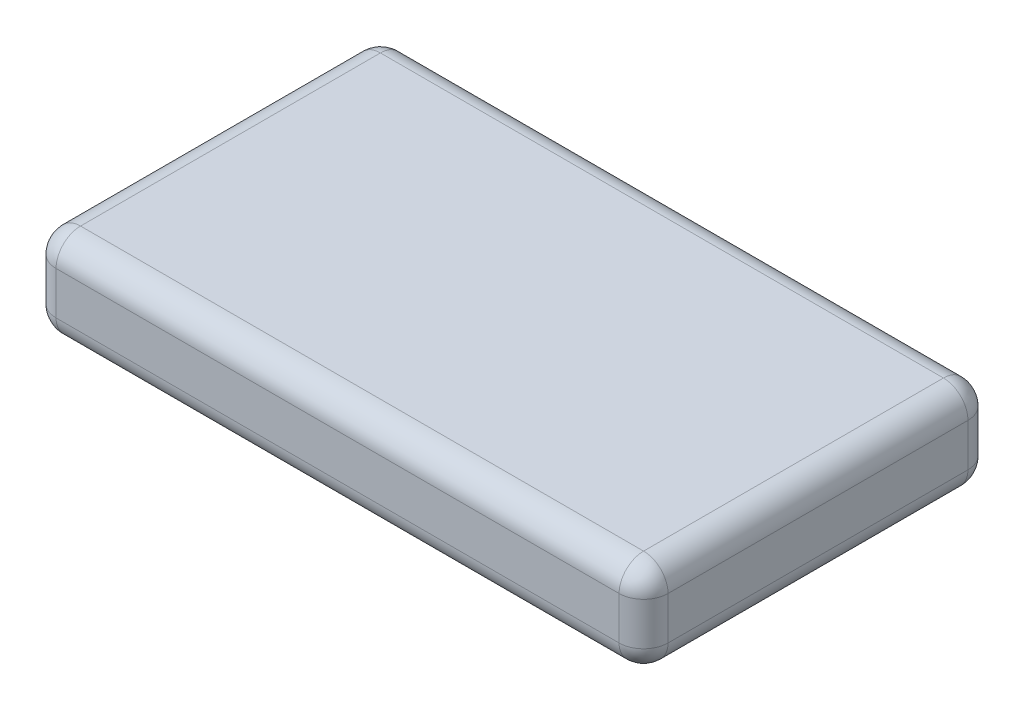
ISO-10303-21;
HEADER;
FILE_DESCRIPTION(('STEP AP214'),'2;1');
FILE_NAME('part.step','',(''),(''),'','','');
FILE_SCHEMA(('AUTOMOTIVE_DESIGN { 1 0 10303 214 1 1 1 1 }'));
ENDSEC;
DATA;
#1=APPLICATION_CONTEXT('core data for automotive mechanical design processes');
#2=APPLICATION_PROTOCOL_DEFINITION('international standard','automotive_design',2000,#1);
#3=PRODUCT_CONTEXT('',#1,'mechanical');
#4=PRODUCT('Part','Part','',(#3));
#5=PRODUCT_RELATED_PRODUCT_CATEGORY('part','',(#4));
#6=PRODUCT_DEFINITION_FORMATION('','',#4);
#7=PRODUCT_DEFINITION_CONTEXT('part definition',#1,'design');
#8=PRODUCT_DEFINITION('design','',#6,#7);
#9=PRODUCT_DEFINITION_SHAPE('','',#8);
#10=(LENGTH_UNIT() NAMED_UNIT(*) SI_UNIT(.MILLI.,.METRE.));
#11=(NAMED_UNIT(*) PLANE_ANGLE_UNIT() SI_UNIT($,.RADIAN.));
#12=(NAMED_UNIT(*) SI_UNIT($,.STERADIAN.) SOLID_ANGLE_UNIT());
#13=UNCERTAINTY_MEASURE_WITH_UNIT(LENGTH_MEASURE(1.E-05),#10,'distance_accuracy_value','');
#14=(GEOMETRIC_REPRESENTATION_CONTEXT(3) GLOBAL_UNCERTAINTY_ASSIGNED_CONTEXT((#13)) GLOBAL_UNIT_ASSIGNED_CONTEXT((#10,
#11,#12)) REPRESENTATION_CONTEXT('',''));
#15=CARTESIAN_POINT('',(0.,0.,0.));
#16=DIRECTION('',(0.,0.,1.));
#17=DIRECTION('',(1.,0.,0.));
#18=AXIS2_PLACEMENT_3D('',#15,#16,#17);
#19=CARTESIAN_POINT('',(25.,7.5,-14.25));
#20=DIRECTION('',(-1.,0.,0.));
#21=DIRECTION('',(0.,0.,1.));
#22=AXIS2_PLACEMENT_3D('',#19,#20,#21);
#23=PLANE('',#22);
#24=DIRECTION('',(0.,0.,-1.));
#25=VECTOR('',#24,1.);
#26=CARTESIAN_POINT('',(25.,2.,-14.25));
#27=LINE('',#26,#25);
#28=CARTESIAN_POINT('',(25.,2.,12.25));
#29=VERTEX_POINT('',#28);
#30=CARTESIAN_POINT('',(25.,2.,-12.25));
#31=VERTEX_POINT('',#30);
#32=EDGE_CURVE('E183',#29,#31,#27,.T.);
#33=ORIENTED_EDGE('',*,*,#32,.T.);
#34=DIRECTION('',(0.,-1.,0.));
#35=VECTOR('',#34,1.);
#36=CARTESIAN_POINT('',(25.,7.5,-12.25));
#37=LINE('',#36,#35);
#38=CARTESIAN_POINT('',(25.,5.5,-12.25));
#39=VERTEX_POINT('',#38);
#40=EDGE_CURVE('E186',#31,#39,#37,.F.);
#41=ORIENTED_EDGE('',*,*,#40,.T.);
#42=DIRECTION('',(0.,0.,-1.));
#43=VECTOR('',#42,1.);
#44=CARTESIAN_POINT('',(25.,5.5,14.25));
#45=LINE('',#44,#43);
#46=CARTESIAN_POINT('',(25.,5.5,12.25));
#47=VERTEX_POINT('',#46);
#48=EDGE_CURVE('E177',#39,#47,#45,.F.);
#49=ORIENTED_EDGE('',*,*,#48,.T.);
#50=DIRECTION('',(0.,-1.,0.));
#51=VECTOR('',#50,1.);
#52=CARTESIAN_POINT('',(25.,7.5,12.25));
#53=LINE('',#52,#51);
#54=EDGE_CURVE('E180',#47,#29,#53,.T.);
#55=ORIENTED_EDGE('',*,*,#54,.T.);
#56=EDGE_LOOP('',(#33,#41,#49,#55));
#57=FACE_BOUND('',#56,.T.);
#58=ADVANCED_FACE('F37',(#57),#23,.F.);
#59=CARTESIAN_POINT('',(-25.,7.5,-14.25));
#60=DIRECTION('',(0.,0.,1.));
#61=DIRECTION('',(1.,0.,0.));
#62=AXIS2_PLACEMENT_3D('',#59,#60,#61);
#63=PLANE('',#62);
#64=DIRECTION('',(0.,-1.,0.));
#65=VECTOR('',#64,1.);
#66=CARTESIAN_POINT('',(23.,7.5,-14.25));
#67=LINE('',#66,#65);
#68=CARTESIAN_POINT('',(23.,5.5,-14.25));
#69=VERTEX_POINT('',#68);
#70=CARTESIAN_POINT('',(23.,2.,-14.25));
#71=VERTEX_POINT('',#70);
#72=EDGE_CURVE('E138',#69,#71,#67,.T.);
#73=ORIENTED_EDGE('',*,*,#72,.T.);
#74=DIRECTION('',(-1.,0.,0.));
#75=VECTOR('',#74,1.);
#76=CARTESIAN_POINT('',(-25.,2.,-14.25));
#77=LINE('',#76,#75);
#78=CARTESIAN_POINT('',(-23.,2.,-14.25));
#79=VERTEX_POINT('',#78);
#80=EDGE_CURVE('E133',#71,#79,#77,.T.);
#81=ORIENTED_EDGE('',*,*,#80,.T.);
#82=DIRECTION('',(0.,-1.,0.));
#83=VECTOR('',#82,1.);
#84=CARTESIAN_POINT('',(-23.,7.5,-14.25));
#85=LINE('',#84,#83);
#86=CARTESIAN_POINT('',(-23.,5.5,-14.25));
#87=VERTEX_POINT('',#86);
#88=EDGE_CURVE('E125',#79,#87,#85,.F.);
#89=ORIENTED_EDGE('',*,*,#88,.T.);
#90=DIRECTION('',(-1.,0.,0.));
#91=VECTOR('',#90,1.);
#92=CARTESIAN_POINT('',(25.,5.5,-14.25));
#93=LINE('',#92,#91);
#94=EDGE_CURVE('E130',#87,#69,#93,.F.);
#95=ORIENTED_EDGE('',*,*,#94,.T.);
#96=EDGE_LOOP('',(#73,#81,#89,#95));
#97=FACE_BOUND('',#96,.T.);
#98=ADVANCED_FACE('F128',(#97),#63,.F.);
#99=CARTESIAN_POINT('',(-25.,7.5,-14.25));
#100=DIRECTION('',(1.,0.,0.));
#101=DIRECTION('',(0.,0.,-1.));
#102=AXIS2_PLACEMENT_3D('',#99,#100,#101);
#103=PLANE('',#102);
#104=DIRECTION('',(0.,0.,1.));
#105=VECTOR('',#104,1.);
#106=CARTESIAN_POINT('',(-25.,5.5,-14.25));
#107=LINE('',#106,#105);
#108=CARTESIAN_POINT('',(-25.,5.5,12.25));
#109=VERTEX_POINT('',#108);
#110=CARTESIAN_POINT('',(-25.,5.5,-12.25));
#111=VERTEX_POINT('',#110);
#112=EDGE_CURVE('E190',#109,#111,#107,.F.);
#113=ORIENTED_EDGE('',*,*,#112,.T.);
#114=DIRECTION('',(0.,-1.,0.));
#115=VECTOR('',#114,1.);
#116=CARTESIAN_POINT('',(-25.,7.5,-12.25));
#117=LINE('',#116,#115);
#118=CARTESIAN_POINT('',(-25.,2.,-12.25));
#119=VERTEX_POINT('',#118);
#120=EDGE_CURVE('E146',#111,#119,#117,.T.);
#121=ORIENTED_EDGE('',*,*,#120,.T.);
#122=DIRECTION('',(0.,0.,1.));
#123=VECTOR('',#122,1.);
#124=CARTESIAN_POINT('',(-25.,2.,-14.25));
#125=LINE('',#124,#123);
#126=CARTESIAN_POINT('',(-25.,2.,12.25));
#127=VERTEX_POINT('',#126);
#128=EDGE_CURVE('E196',#119,#127,#125,.T.);
#129=ORIENTED_EDGE('',*,*,#128,.T.);
#130=DIRECTION('',(0.,-1.,0.));
#131=VECTOR('',#130,1.);
#132=CARTESIAN_POINT('',(-25.,7.5,12.25));
#133=LINE('',#132,#131);
#134=EDGE_CURVE('E193',#127,#109,#133,.F.);
#135=ORIENTED_EDGE('',*,*,#134,.T.);
#136=EDGE_LOOP('',(#113,#121,#129,#135));
#137=FACE_BOUND('',#136,.T.);
#138=ADVANCED_FACE('F376',(#137),#103,.F.);
#139=CARTESIAN_POINT('',(-25.,7.5,14.25));
#140=DIRECTION('',(0.,0.,-1.));
#141=DIRECTION('',(-1.,0.,0.));
#142=AXIS2_PLACEMENT_3D('',#139,#140,#141);
#143=PLANE('',#142);
#144=DIRECTION('',(0.,-1.,0.));
#145=VECTOR('',#144,1.);
#146=CARTESIAN_POINT('',(-23.,7.5,14.25));
#147=LINE('',#146,#145);
#148=CARTESIAN_POINT('',(-23.,5.5,14.25));
#149=VERTEX_POINT('',#148);
#150=CARTESIAN_POINT('',(-23.,2.,14.25));
#151=VERTEX_POINT('',#150);
#152=EDGE_CURVE('E220',#149,#151,#147,.T.);
#153=ORIENTED_EDGE('',*,*,#152,.T.);
#154=DIRECTION('',(1.,0.,0.));
#155=VECTOR('',#154,1.);
#156=CARTESIAN_POINT('',(-25.,2.,14.25));
#157=LINE('',#156,#155);
#158=CARTESIAN_POINT('',(23.,2.,14.25));
#159=VERTEX_POINT('',#158);
#160=EDGE_CURVE('E224',#151,#159,#157,.T.);
#161=ORIENTED_EDGE('',*,*,#160,.T.);
#162=DIRECTION('',(0.,-1.,0.));
#163=VECTOR('',#162,1.);
#164=CARTESIAN_POINT('',(23.,7.5,14.25));
#165=LINE('',#164,#163);
#166=CARTESIAN_POINT('',(23.,5.5,14.25));
#167=VERTEX_POINT('',#166);
#168=EDGE_CURVE('E217',#159,#167,#165,.F.);
#169=ORIENTED_EDGE('',*,*,#168,.T.);
#170=DIRECTION('',(1.,0.,0.));
#171=VECTOR('',#170,1.);
#172=CARTESIAN_POINT('',(-25.,5.5,14.25));
#173=LINE('',#172,#171);
#174=EDGE_CURVE('E214',#167,#149,#173,.F.);
#175=ORIENTED_EDGE('',*,*,#174,.T.);
#176=EDGE_LOOP('',(#153,#161,#169,#175));
#177=FACE_BOUND('',#176,.T.);
#178=ADVANCED_FACE('F325',(#177),#143,.F.);
#179=CARTESIAN_POINT('',(0.,7.5,0.));
#180=DIRECTION('',(0.,1.,0.));
#181=DIRECTION('',(0.,0.,1.));
#182=AXIS2_PLACEMENT_3D('',#179,#180,#181);
#183=PLANE('',#182);
#184=DIRECTION('',(0.,0.,1.));
#185=VECTOR('',#184,1.);
#186=CARTESIAN_POINT('',(-23.,7.5,14.25));
#187=LINE('',#186,#185);
#188=CARTESIAN_POINT('',(-23.,7.5,-12.25));
#189=VERTEX_POINT('',#188);
#190=CARTESIAN_POINT('',(-23.,7.5,12.25));
#191=VERTEX_POINT('',#190);
#192=EDGE_CURVE('E47',#189,#191,#187,.T.);
#193=ORIENTED_EDGE('',*,*,#192,.T.);
#194=DIRECTION('',(1.,0.,0.));
#195=VECTOR('',#194,1.);
#196=CARTESIAN_POINT('',(25.,7.5,12.25));
#197=LINE('',#196,#195);
#198=CARTESIAN_POINT('',(23.,7.5,12.25));
#199=VERTEX_POINT('',#198);
#200=EDGE_CURVE('E11',#191,#199,#197,.T.);
#201=ORIENTED_EDGE('',*,*,#200,.T.);
#202=DIRECTION('',(0.,0.,-1.));
#203=VECTOR('',#202,1.);
#204=CARTESIAN_POINT('',(23.,7.5,-14.25));
#205=LINE('',#204,#203);
#206=CARTESIAN_POINT('',(23.,7.5,-12.25));
#207=VERTEX_POINT('',#206);
#208=EDGE_CURVE('E227',#199,#207,#205,.T.);
#209=ORIENTED_EDGE('',*,*,#208,.T.);
#210=DIRECTION('',(-1.,0.,0.));
#211=VECTOR('',#210,1.);
#212=CARTESIAN_POINT('',(-25.,7.5,-12.25));
#213=LINE('',#212,#211);
#214=EDGE_CURVE('E58',#207,#189,#213,.T.);
#215=ORIENTED_EDGE('',*,*,#214,.T.);
#216=EDGE_LOOP('',(#193,#201,#209,#215));
#217=FACE_BOUND('',#216,.T.);
#218=ADVANCED_FACE('F340',(#217),#183,.T.);
#219=CARTESIAN_POINT('',(0.,0.,0.));
#220=DIRECTION('',(0.,1.,0.));
#221=DIRECTION('',(0.,0.,1.));
#222=AXIS2_PLACEMENT_3D('',#219,#220,#221);
#223=PLANE('',#222);
#224=DIRECTION('',(0.,0.,1.));
#225=VECTOR('',#224,1.);
#226=CARTESIAN_POINT('',(-23.,0.,0.));
#227=LINE('',#226,#225);
#228=CARTESIAN_POINT('',(-23.,0.,12.25));
#229=VERTEX_POINT('',#228);
#230=CARTESIAN_POINT('',(-23.,0.,-12.25));
#231=VERTEX_POINT('',#230);
#232=EDGE_CURVE('E207',#229,#231,#227,.F.);
#233=ORIENTED_EDGE('',*,*,#232,.T.);
#234=DIRECTION('',(-1.,0.,0.));
#235=VECTOR('',#234,1.);
#236=CARTESIAN_POINT('',(0.,0.,-12.25));
#237=LINE('',#236,#235);
#238=CARTESIAN_POINT('',(23.,0.,-12.25));
#239=VERTEX_POINT('',#238);
#240=EDGE_CURVE('E210',#231,#239,#237,.F.);
#241=ORIENTED_EDGE('',*,*,#240,.T.);
#242=DIRECTION('',(0.,0.,-1.));
#243=VECTOR('',#242,1.);
#244=CARTESIAN_POINT('',(23.,0.,0.));
#245=LINE('',#244,#243);
#246=CARTESIAN_POINT('',(23.,0.,12.25));
#247=VERTEX_POINT('',#246);
#248=EDGE_CURVE('E204',#239,#247,#245,.F.);
#249=ORIENTED_EDGE('',*,*,#248,.T.);
#250=DIRECTION('',(1.,0.,0.));
#251=VECTOR('',#250,1.);
#252=CARTESIAN_POINT('',(0.,0.,12.25));
#253=LINE('',#252,#251);
#254=EDGE_CURVE('E201',#247,#229,#253,.F.);
#255=ORIENTED_EDGE('',*,*,#254,.T.);
#256=EDGE_LOOP('',(#233,#241,#249,#255));
#257=FACE_BOUND('',#256,.T.);
#258=ADVANCED_FACE('F316',(#257),#223,.F.);
#259=CARTESIAN_POINT('',(-23.,7.5,12.25));
#260=DIRECTION('',(0.,-1.,0.));
#261=DIRECTION('',(0.,0.,-1.));
#262=AXIS2_PLACEMENT_3D('',#259,#260,#261);
#263=CYLINDRICAL_SURFACE('',#262,2.);
#264=CARTESIAN_POINT('',(-23.,5.5,12.25));
#265=DIRECTION('',(0.,1.,0.));
#266=DIRECTION('',(0.,0.,1.));
#267=AXIS2_PLACEMENT_3D('',#264,#265,#266);
#268=CIRCLE('',#267,2.);
#269=EDGE_CURVE('E41',#109,#149,#268,.T.);
#270=ORIENTED_EDGE('',*,*,#269,.F.);
#271=ORIENTED_EDGE('',*,*,#134,.F.);
#272=CARTESIAN_POINT('',(-23.,2.,12.25));
#273=DIRECTION('',(0.,-1.,0.));
#274=DIRECTION('',(0.,0.,-1.));
#275=AXIS2_PLACEMENT_3D('',#272,#273,#274);
#276=CIRCLE('',#275,2.);
#277=EDGE_CURVE('E171',#151,#127,#276,.T.);
#278=ORIENTED_EDGE('',*,*,#277,.F.);
#279=ORIENTED_EDGE('',*,*,#152,.F.);
#280=EDGE_LOOP('',(#270,#271,#278,#279));
#281=FACE_BOUND('',#280,.T.);
#282=ADVANCED_FACE('F39',(#281),#263,.T.);
#283=CARTESIAN_POINT('',(-23.,5.5,12.25));
#284=DIRECTION('',(0.,0.,1.));
#285=DIRECTION('',(1.,0.,0.));
#286=AXIS2_PLACEMENT_3D('',#283,#284,#285);
#287=SPHERICAL_SURFACE('',#286,2.);
#288=CARTESIAN_POINT('',(-23.,5.5,12.25));
#289=DIRECTION('',(0.,0.,1.));
#290=DIRECTION('',(1.,0.,0.));
#291=AXIS2_PLACEMENT_3D('',#288,#289,#290);
#292=CIRCLE('',#291,2.);
#293=EDGE_CURVE('E293',#109,#191,#292,.F.);
#294=ORIENTED_EDGE('',*,*,#293,.F.);
#295=ORIENTED_EDGE('',*,*,#269,.T.);
#296=CARTESIAN_POINT('',(-23.,5.5,12.25));
#297=DIRECTION('',(-1.,0.,0.));
#298=DIRECTION('',(0.,-1.,0.));
#299=AXIS2_PLACEMENT_3D('',#296,#297,#298);
#300=CIRCLE('',#299,2.);
#301=EDGE_CURVE('E296',#191,#149,#300,.F.);
#302=ORIENTED_EDGE('',*,*,#301,.F.);
#303=EDGE_LOOP('',(#294,#295,#302));
#304=FACE_BOUND('',#303,.T.);
#305=ADVANCED_FACE('F526',(#304),#287,.T.);
#306=CARTESIAN_POINT('',(-23.,2.,12.25));
#307=DIRECTION('',(0.,0.,1.));
#308=DIRECTION('',(1.,0.,0.));
#309=AXIS2_PLACEMENT_3D('',#306,#307,#308);
#310=SPHERICAL_SURFACE('',#309,2.);
#311=CARTESIAN_POINT('',(-23.,2.,12.25));
#312=DIRECTION('',(-1.,0.,0.));
#313=DIRECTION('',(0.,0.,1.));
#314=AXIS2_PLACEMENT_3D('',#311,#312,#313);
#315=CIRCLE('',#314,2.);
#316=EDGE_CURVE('E286',#151,#229,#315,.F.);
#317=ORIENTED_EDGE('',*,*,#316,.F.);
#318=ORIENTED_EDGE('',*,*,#277,.T.);
#319=CARTESIAN_POINT('',(-23.,2.,12.25));
#320=DIRECTION('',(0.,0.,1.));
#321=DIRECTION('',(1.,0.,0.));
#322=AXIS2_PLACEMENT_3D('',#319,#320,#321);
#323=CIRCLE('',#322,2.);
#324=EDGE_CURVE('E289',#229,#127,#323,.F.);
#325=ORIENTED_EDGE('',*,*,#324,.F.);
#326=EDGE_LOOP('',(#317,#318,#325));
#327=FACE_BOUND('',#326,.T.);
#328=ADVANCED_FACE('F305',(#327),#310,.T.);
#329=CARTESIAN_POINT('',(0.,5.5,12.25));
#330=DIRECTION('',(-1.,0.,0.));
#331=DIRECTION('',(0.,0.,1.));
#332=AXIS2_PLACEMENT_3D('',#329,#330,#331);
#333=CYLINDRICAL_SURFACE('',#332,2.);
#334=ORIENTED_EDGE('',*,*,#301,.T.);
#335=ORIENTED_EDGE('',*,*,#174,.F.);
#336=CARTESIAN_POINT('',(23.,5.5,12.25));
#337=DIRECTION('',(1.,0.,0.));
#338=DIRECTION('',(0.,0.,-1.));
#339=AXIS2_PLACEMENT_3D('',#336,#337,#338);
#340=CIRCLE('',#339,2.);
#341=EDGE_CURVE('E278',#199,#167,#340,.T.);
#342=ORIENTED_EDGE('',*,*,#341,.F.);
#343=ORIENTED_EDGE('',*,*,#200,.F.);
#344=EDGE_LOOP('',(#334,#335,#342,#343));
#345=FACE_BOUND('',#344,.T.);
#346=ADVANCED_FACE('F339',(#345),#333,.T.);
#347=CARTESIAN_POINT('',(-23.,5.5,0.));
#348=DIRECTION('',(0.,0.,-1.));
#349=DIRECTION('',(-1.,0.,0.));
#350=AXIS2_PLACEMENT_3D('',#347,#348,#349);
#351=CYLINDRICAL_SURFACE('',#350,2.);
#352=ORIENTED_EDGE('',*,*,#293,.T.);
#353=ORIENTED_EDGE('',*,*,#192,.F.);
#354=CARTESIAN_POINT('',(-23.,5.5,-12.25));
#355=DIRECTION('',(0.,0.,-1.));
#356=DIRECTION('',(-1.,0.,0.));
#357=AXIS2_PLACEMENT_3D('',#354,#355,#356);
#358=CIRCLE('',#357,2.);
#359=EDGE_CURVE('E151',#111,#189,#358,.T.);
#360=ORIENTED_EDGE('',*,*,#359,.F.);
#361=ORIENTED_EDGE('',*,*,#112,.F.);
#362=EDGE_LOOP('',(#352,#353,#360,#361));
#363=FACE_BOUND('',#362,.T.);
#364=ADVANCED_FACE('F500',(#363),#351,.T.);
#365=CARTESIAN_POINT('',(-23.,7.5,-12.25));
#366=DIRECTION('',(0.,-1.,0.));
#367=DIRECTION('',(0.,0.,-1.));
#368=AXIS2_PLACEMENT_3D('',#365,#366,#367);
#369=CYLINDRICAL_SURFACE('',#368,2.);
#370=CARTESIAN_POINT('',(-23.,2.,-12.25));
#371=DIRECTION('',(0.,-1.,0.));
#372=DIRECTION('',(0.,0.,-1.));
#373=AXIS2_PLACEMENT_3D('',#370,#371,#372);
#374=CIRCLE('',#373,2.);
#375=EDGE_CURVE('E152',#119,#79,#374,.T.);
#376=ORIENTED_EDGE('',*,*,#375,.F.);
#377=ORIENTED_EDGE('',*,*,#120,.F.);
#378=CARTESIAN_POINT('',(-23.,5.5,-12.25));
#379=DIRECTION('',(0.,1.,0.));
#380=DIRECTION('',(0.,0.,1.));
#381=AXIS2_PLACEMENT_3D('',#378,#379,#380);
#382=CIRCLE('',#381,2.);
#383=EDGE_CURVE('E142',#87,#111,#382,.T.);
#384=ORIENTED_EDGE('',*,*,#383,.F.);
#385=ORIENTED_EDGE('',*,*,#88,.F.);
#386=EDGE_LOOP('',(#376,#377,#384,#385));
#387=FACE_BOUND('',#386,.T.);
#388=ADVANCED_FACE('F144',(#387),#369,.T.);
#389=CARTESIAN_POINT('',(-23.,2.,-14.25));
#390=DIRECTION('',(0.,0.,1.));
#391=DIRECTION('',(1.,0.,0.));
#392=AXIS2_PLACEMENT_3D('',#389,#390,#391);
#393=CYLINDRICAL_SURFACE('',#392,2.);
#394=ORIENTED_EDGE('',*,*,#324,.T.);
#395=ORIENTED_EDGE('',*,*,#128,.F.);
#396=CARTESIAN_POINT('',(-23.,2.,-12.25));
#397=DIRECTION('',(0.,0.,-1.));
#398=DIRECTION('',(-1.,0.,0.));
#399=AXIS2_PLACEMENT_3D('',#396,#397,#398);
#400=CIRCLE('',#399,2.);
#401=EDGE_CURVE('E271',#231,#119,#400,.T.);
#402=ORIENTED_EDGE('',*,*,#401,.F.);
#403=ORIENTED_EDGE('',*,*,#232,.F.);
#404=EDGE_LOOP('',(#394,#395,#402,#403));
#405=FACE_BOUND('',#404,.T.);
#406=ADVANCED_FACE('F312',(#405),#393,.T.);
#407=CARTESIAN_POINT('',(-25.,2.,12.25));
#408=DIRECTION('',(1.,0.,0.));
#409=DIRECTION('',(0.,0.,-1.));
#410=AXIS2_PLACEMENT_3D('',#407,#408,#409);
#411=CYLINDRICAL_SURFACE('',#410,2.);
#412=ORIENTED_EDGE('',*,*,#316,.T.);
#413=ORIENTED_EDGE('',*,*,#254,.F.);
#414=CARTESIAN_POINT('',(23.,2.,12.25));
#415=DIRECTION('',(1.,0.,0.));
#416=DIRECTION('',(0.,0.,-1.));
#417=AXIS2_PLACEMENT_3D('',#414,#415,#416);
#418=CIRCLE('',#417,2.);
#419=EDGE_CURVE('E267',#159,#247,#418,.T.);
#420=ORIENTED_EDGE('',*,*,#419,.F.);
#421=ORIENTED_EDGE('',*,*,#160,.F.);
#422=EDGE_LOOP('',(#412,#413,#420,#421));
#423=FACE_BOUND('',#422,.T.);
#424=ADVANCED_FACE('F322',(#423),#411,.T.);
#425=CARTESIAN_POINT('',(23.,7.5,12.25));
#426=DIRECTION('',(0.,-1.,0.));
#427=DIRECTION('',(0.,0.,-1.));
#428=AXIS2_PLACEMENT_3D('',#425,#426,#427);
#429=CYLINDRICAL_SURFACE('',#428,2.);
#430=CARTESIAN_POINT('',(23.,5.5,12.25));
#431=DIRECTION('',(0.,1.,0.));
#432=DIRECTION('',(0.,0.,1.));
#433=AXIS2_PLACEMENT_3D('',#430,#431,#432);
#434=CIRCLE('',#433,2.);
#435=EDGE_CURVE('E282',#167,#47,#434,.T.);
#436=ORIENTED_EDGE('',*,*,#435,.F.);
#437=ORIENTED_EDGE('',*,*,#168,.F.);
#438=CARTESIAN_POINT('',(23.,2.,12.25));
#439=DIRECTION('',(0.,-1.,0.));
#440=DIRECTION('',(0.,0.,-1.));
#441=AXIS2_PLACEMENT_3D('',#438,#439,#440);
#442=CIRCLE('',#441,2.);
#443=EDGE_CURVE('E263',#29,#159,#442,.T.);
#444=ORIENTED_EDGE('',*,*,#443,.F.);
#445=ORIENTED_EDGE('',*,*,#54,.F.);
#446=EDGE_LOOP('',(#436,#437,#444,#445));
#447=FACE_BOUND('',#446,.T.);
#448=ADVANCED_FACE('F330',(#447),#429,.T.);
#449=CARTESIAN_POINT('',(23.,5.5,12.25));
#450=DIRECTION('',(0.,0.,1.));
#451=DIRECTION('',(1.,0.,0.));
#452=AXIS2_PLACEMENT_3D('',#449,#450,#451);
#453=SPHERICAL_SURFACE('',#452,2.);
#454=ORIENTED_EDGE('',*,*,#341,.T.);
#455=ORIENTED_EDGE('',*,*,#435,.T.);
#456=CARTESIAN_POINT('',(23.,5.5,12.25));
#457=DIRECTION('',(0.,0.,1.));
#458=DIRECTION('',(0.,-1.,0.));
#459=AXIS2_PLACEMENT_3D('',#456,#457,#458);
#460=CIRCLE('',#459,2.);
#461=EDGE_CURVE('E159',#199,#47,#460,.F.);
#462=ORIENTED_EDGE('',*,*,#461,.F.);
#463=EDGE_LOOP('',(#454,#455,#462));
#464=FACE_BOUND('',#463,.T.);
#465=ADVANCED_FACE('F336',(#464),#453,.T.);
#466=CARTESIAN_POINT('',(-23.,5.5,-12.25));
#467=DIRECTION('',(0.,0.,1.));
#468=DIRECTION('',(1.,0.,0.));
#469=AXIS2_PLACEMENT_3D('',#466,#467,#468);
#470=SPHERICAL_SURFACE('',#469,2.);
#471=ORIENTED_EDGE('',*,*,#383,.T.);
#472=ORIENTED_EDGE('',*,*,#359,.T.);
#473=CARTESIAN_POINT('',(-23.,5.5,-12.25));
#474=DIRECTION('',(-1.,0.,0.));
#475=DIRECTION('',(0.,0.,1.));
#476=AXIS2_PLACEMENT_3D('',#473,#474,#475);
#477=CIRCLE('',#476,2.);
#478=EDGE_CURVE('E155',#87,#189,#477,.F.);
#479=ORIENTED_EDGE('',*,*,#478,.F.);
#480=EDGE_LOOP('',(#471,#472,#479));
#481=FACE_BOUND('',#480,.T.);
#482=ADVANCED_FACE('F156',(#481),#470,.T.);
#483=CARTESIAN_POINT('',(-23.,2.,-12.25));
#484=DIRECTION('',(0.,0.,1.));
#485=DIRECTION('',(1.,0.,0.));
#486=AXIS2_PLACEMENT_3D('',#483,#484,#485);
#487=SPHERICAL_SURFACE('',#486,2.);
#488=ORIENTED_EDGE('',*,*,#401,.T.);
#489=ORIENTED_EDGE('',*,*,#375,.T.);
#490=CARTESIAN_POINT('',(-23.,2.,-12.25));
#491=DIRECTION('',(-1.,0.,0.));
#492=DIRECTION('',(0.,0.,1.));
#493=AXIS2_PLACEMENT_3D('',#490,#491,#492);
#494=CIRCLE('',#493,2.);
#495=EDGE_CURVE('E160',#231,#79,#494,.F.);
#496=ORIENTED_EDGE('',*,*,#495,.F.);
#497=EDGE_LOOP('',(#488,#489,#496));
#498=FACE_BOUND('',#497,.T.);
#499=ADVANCED_FACE('F359',(#498),#487,.T.);
#500=CARTESIAN_POINT('',(23.,2.,12.25));
#501=DIRECTION('',(0.,0.,1.));
#502=DIRECTION('',(1.,0.,0.));
#503=AXIS2_PLACEMENT_3D('',#500,#501,#502);
#504=SPHERICAL_SURFACE('',#503,2.);
#505=ORIENTED_EDGE('',*,*,#443,.T.);
#506=ORIENTED_EDGE('',*,*,#419,.T.);
#507=CARTESIAN_POINT('',(23.,2.,12.25));
#508=DIRECTION('',(0.,0.,1.));
#509=DIRECTION('',(1.,0.,0.));
#510=AXIS2_PLACEMENT_3D('',#507,#508,#509);
#511=CIRCLE('',#510,2.);
#512=EDGE_CURVE('E253',#29,#247,#511,.F.);
#513=ORIENTED_EDGE('',*,*,#512,.F.);
#514=EDGE_LOOP('',(#505,#506,#513));
#515=FACE_BOUND('',#514,.T.);
#516=ADVANCED_FACE('F361',(#515),#504,.T.);
#517=CARTESIAN_POINT('',(23.,5.5,0.));
#518=DIRECTION('',(0.,0.,1.));
#519=DIRECTION('',(1.,0.,0.));
#520=AXIS2_PLACEMENT_3D('',#517,#518,#519);
#521=CYLINDRICAL_SURFACE('',#520,2.);
#522=ORIENTED_EDGE('',*,*,#461,.T.);
#523=ORIENTED_EDGE('',*,*,#48,.F.);
#524=CARTESIAN_POINT('',(23.,5.5,-12.25));
#525=DIRECTION('',(0.,0.,-1.));
#526=DIRECTION('',(-1.,0.,0.));
#527=AXIS2_PLACEMENT_3D('',#524,#525,#526);
#528=CIRCLE('',#527,2.);
#529=EDGE_CURVE('E249',#207,#39,#528,.T.);
#530=ORIENTED_EDGE('',*,*,#529,.F.);
#531=ORIENTED_EDGE('',*,*,#208,.F.);
#532=EDGE_LOOP('',(#522,#523,#530,#531));
#533=FACE_BOUND('',#532,.T.);
#534=ADVANCED_FACE('F344',(#533),#521,.T.);
#535=CARTESIAN_POINT('',(0.,5.5,-12.25));
#536=DIRECTION('',(1.,0.,0.));
#537=DIRECTION('',(0.,0.,-1.));
#538=AXIS2_PLACEMENT_3D('',#535,#536,#537);
#539=CYLINDRICAL_SURFACE('',#538,2.);
#540=ORIENTED_EDGE('',*,*,#478,.T.);
#541=ORIENTED_EDGE('',*,*,#214,.F.);
#542=CARTESIAN_POINT('',(23.,5.5,-12.25));
#543=DIRECTION('',(1.,0.,0.));
#544=DIRECTION('',(0.,1.,0.));
#545=AXIS2_PLACEMENT_3D('',#542,#543,#544);
#546=CIRCLE('',#545,2.);
#547=EDGE_CURVE('E164',#69,#207,#546,.T.);
#548=ORIENTED_EDGE('',*,*,#547,.F.);
#549=ORIENTED_EDGE('',*,*,#94,.F.);
#550=EDGE_LOOP('',(#540,#541,#548,#549));
#551=FACE_BOUND('',#550,.T.);
#552=ADVANCED_FACE('F162',(#551),#539,.T.);
#553=CARTESIAN_POINT('',(-25.,2.,-12.25));
#554=DIRECTION('',(-1.,0.,0.));
#555=DIRECTION('',(0.,0.,1.));
#556=AXIS2_PLACEMENT_3D('',#553,#554,#555);
#557=CYLINDRICAL_SURFACE('',#556,2.);
#558=ORIENTED_EDGE('',*,*,#495,.T.);
#559=ORIENTED_EDGE('',*,*,#80,.F.);
#560=CARTESIAN_POINT('',(23.,2.,-12.25));
#561=DIRECTION('',(1.,0.,0.));
#562=DIRECTION('',(0.,0.,-1.));
#563=AXIS2_PLACEMENT_3D('',#560,#561,#562);
#564=CIRCLE('',#563,2.);
#565=EDGE_CURVE('E243',#239,#71,#564,.T.);
#566=ORIENTED_EDGE('',*,*,#565,.F.);
#567=ORIENTED_EDGE('',*,*,#240,.F.);
#568=EDGE_LOOP('',(#558,#559,#566,#567));
#569=FACE_BOUND('',#568,.T.);
#570=ADVANCED_FACE('F357',(#569),#557,.T.);
#571=CARTESIAN_POINT('',(23.,2.,-14.25));
#572=DIRECTION('',(0.,0.,-1.));
#573=DIRECTION('',(-1.,0.,0.));
#574=AXIS2_PLACEMENT_3D('',#571,#572,#573);
#575=CYLINDRICAL_SURFACE('',#574,2.);
#576=ORIENTED_EDGE('',*,*,#512,.T.);
#577=ORIENTED_EDGE('',*,*,#248,.F.);
#578=CARTESIAN_POINT('',(23.,2.,-12.25));
#579=DIRECTION('',(0.,0.,-1.));
#580=DIRECTION('',(-1.,0.,0.));
#581=AXIS2_PLACEMENT_3D('',#578,#579,#580);
#582=CIRCLE('',#581,2.);
#583=EDGE_CURVE('E240',#31,#239,#582,.T.);
#584=ORIENTED_EDGE('',*,*,#583,.F.);
#585=ORIENTED_EDGE('',*,*,#32,.F.);
#586=EDGE_LOOP('',(#576,#577,#584,#585));
#587=FACE_BOUND('',#586,.T.);
#588=ADVANCED_FACE('F386',(#587),#575,.T.);
#589=CARTESIAN_POINT('',(23.,5.5,-12.25));
#590=DIRECTION('',(0.,0.,1.));
#591=DIRECTION('',(1.,0.,0.));
#592=AXIS2_PLACEMENT_3D('',#589,#590,#591);
#593=SPHERICAL_SURFACE('',#592,2.);
#594=ORIENTED_EDGE('',*,*,#547,.T.);
#595=ORIENTED_EDGE('',*,*,#529,.T.);
#596=CARTESIAN_POINT('',(23.,5.5,-12.25));
#597=DIRECTION('',(0.,1.,0.));
#598=DIRECTION('',(0.,0.,1.));
#599=AXIS2_PLACEMENT_3D('',#596,#597,#598);
#600=CIRCLE('',#599,2.);
#601=EDGE_CURVE('E237',#69,#39,#600,.F.);
#602=ORIENTED_EDGE('',*,*,#601,.F.);
#603=EDGE_LOOP('',(#594,#595,#602));
#604=FACE_BOUND('',#603,.T.);
#605=ADVANCED_FACE('F346',(#604),#593,.T.);
#606=CARTESIAN_POINT('',(23.,2.,-12.25));
#607=DIRECTION('',(0.,0.,1.));
#608=DIRECTION('',(1.,0.,0.));
#609=AXIS2_PLACEMENT_3D('',#606,#607,#608);
#610=SPHERICAL_SURFACE('',#609,2.);
#611=ORIENTED_EDGE('',*,*,#583,.T.);
#612=ORIENTED_EDGE('',*,*,#565,.T.);
#613=CARTESIAN_POINT('',(23.,2.,-12.25));
#614=DIRECTION('',(0.,-1.,0.));
#615=DIRECTION('',(0.,0.,-1.));
#616=AXIS2_PLACEMENT_3D('',#613,#614,#615);
#617=CIRCLE('',#616,2.);
#618=EDGE_CURVE('E234',#31,#71,#617,.F.);
#619=ORIENTED_EDGE('',*,*,#618,.F.);
#620=EDGE_LOOP('',(#611,#612,#619));
#621=FACE_BOUND('',#620,.T.);
#622=ADVANCED_FACE('F354',(#621),#610,.T.);
#623=CARTESIAN_POINT('',(23.,7.5,-12.25));
#624=DIRECTION('',(0.,-1.,0.));
#625=DIRECTION('',(0.,0.,-1.));
#626=AXIS2_PLACEMENT_3D('',#623,#624,#625);
#627=CYLINDRICAL_SURFACE('',#626,2.);
#628=ORIENTED_EDGE('',*,*,#601,.T.);
#629=ORIENTED_EDGE('',*,*,#40,.F.);
#630=ORIENTED_EDGE('',*,*,#618,.T.);
#631=ORIENTED_EDGE('',*,*,#72,.F.);
#632=EDGE_LOOP('',(#628,#629,#630,#631));
#633=FACE_BOUND('',#632,.T.);
#634=ADVANCED_FACE('F350',(#633),#627,.T.);
#635=CLOSED_SHELL('',(#58,#98,#138,#178,#218,#258,#282,#305,#328,#346,#364,#388,#406,#424,#448,
#465,#482,#499,#516,#534,#552,#570,#588,#605,#622,#634));
#636=MANIFOLD_SOLID_BREP('B2',#635);
#637=ADVANCED_BREP_SHAPE_REPRESENTATION('',(#18,#636),#14);
#638=SHAPE_DEFINITION_REPRESENTATION(#9,#637);
ENDSEC;
END-ISO-10303-21;
